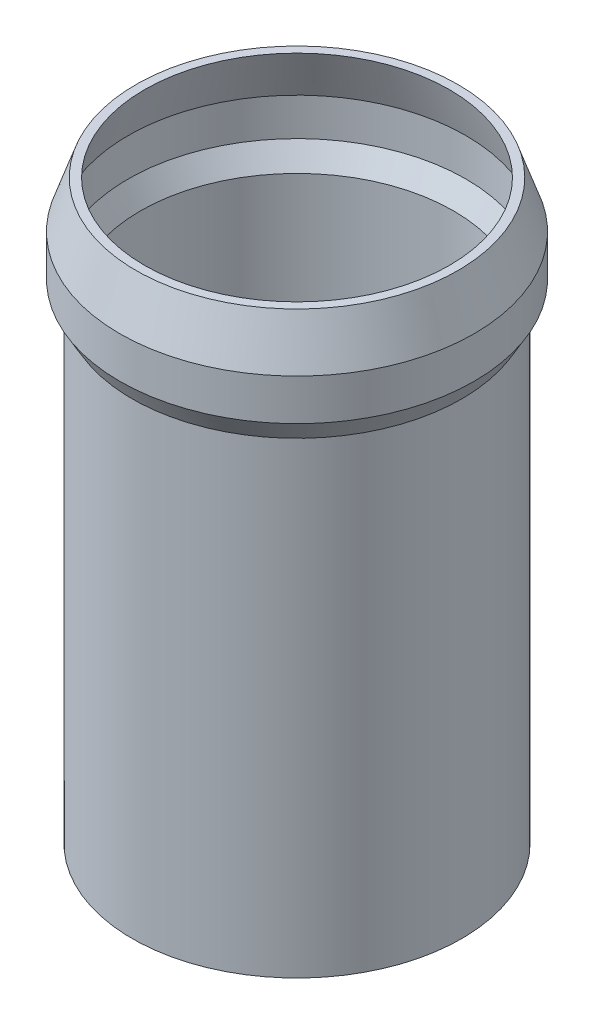
ISO-10303-21;
HEADER;
FILE_DESCRIPTION(('STEP AP214'),'2;1');
FILE_NAME('part.step','',(''),(''),'','','');
FILE_SCHEMA(('AUTOMOTIVE_DESIGN { 1 0 10303 214 1 1 1 1 }'));
ENDSEC;
DATA;
#1=APPLICATION_CONTEXT('core data for automotive mechanical design processes');
#2=APPLICATION_PROTOCOL_DEFINITION('international standard','automotive_design',2000,#1);
#3=PRODUCT_CONTEXT('',#1,'mechanical');
#4=PRODUCT('Part','Part','',(#3));
#5=PRODUCT_RELATED_PRODUCT_CATEGORY('part','',(#4));
#6=PRODUCT_DEFINITION_FORMATION('','',#4);
#7=PRODUCT_DEFINITION_CONTEXT('part definition',#1,'design');
#8=PRODUCT_DEFINITION('design','',#6,#7);
#9=PRODUCT_DEFINITION_SHAPE('','',#8);
#10=(LENGTH_UNIT() NAMED_UNIT(*) SI_UNIT(.MILLI.,.METRE.));
#11=(NAMED_UNIT(*) PLANE_ANGLE_UNIT() SI_UNIT($,.RADIAN.));
#12=(NAMED_UNIT(*) SI_UNIT($,.STERADIAN.) SOLID_ANGLE_UNIT());
#13=UNCERTAINTY_MEASURE_WITH_UNIT(LENGTH_MEASURE(1.E-05),#10,'distance_accuracy_value','');
#14=(GEOMETRIC_REPRESENTATION_CONTEXT(3) GLOBAL_UNCERTAINTY_ASSIGNED_CONTEXT((#13)) GLOBAL_UNIT_ASSIGNED_CONTEXT((#10,
#11,#12)) REPRESENTATION_CONTEXT('',''));
#15=CARTESIAN_POINT('',(0.,0.,0.));
#16=DIRECTION('',(0.,0.,1.));
#17=DIRECTION('',(1.,0.,0.));
#18=AXIS2_PLACEMENT_3D('',#15,#16,#17);
#19=CARTESIAN_POINT('',(20.,0.,0.));
#20=DIRECTION('',(0.,-1.,0.));
#21=DIRECTION('',(0.,0.,-1.));
#22=AXIS2_PLACEMENT_3D('',#19,#20,#21);
#23=PLANE('',#22);
#24=CARTESIAN_POINT('',(0.,0.,0.));
#25=DIRECTION('',(0.,-1.,0.));
#26=DIRECTION('',(0.,0.,-1.));
#27=AXIS2_PLACEMENT_3D('',#24,#25,#26);
#28=CIRCLE('',#27,20.);
#29=CARTESIAN_POINT('',(0.,0.,-20.));
#30=VERTEX_POINT('',#29);
#31=EDGE_CURVE('E80',#30,#30,#28,.T.);
#32=ORIENTED_EDGE('',*,*,#31,.T.);
#33=EDGE_LOOP('',(#32));
#34=FACE_BOUND('',#33,.T.);
#35=CARTESIAN_POINT('',(0.,0.,0.));
#36=DIRECTION('',(0.,-1.,0.));
#37=DIRECTION('',(0.,0.,-1.));
#38=AXIS2_PLACEMENT_3D('',#35,#36,#37);
#39=CIRCLE('',#38,19.);
#40=CARTESIAN_POINT('',(0.,0.,-19.));
#41=VERTEX_POINT('',#40);
#42=EDGE_CURVE('E53',#41,#41,#39,.T.);
#43=ORIENTED_EDGE('',*,*,#42,.F.);
#44=EDGE_LOOP('',(#43));
#45=FACE_BOUND('',#44,.T.);
#46=ADVANCED_FACE('F40',(#34,#45),#23,.T.);
#47=CARTESIAN_POINT('',(0.,2.4,0.));
#48=DIRECTION('',(0.,-1.,0.));
#49=DIRECTION('',(0.,0.,-1.));
#50=AXIS2_PLACEMENT_3D('',#47,#48,#49);
#51=CYLINDRICAL_SURFACE('',#50,19.);
#52=ORIENTED_EDGE('',*,*,#42,.T.);
#53=EDGE_LOOP('',(#52));
#54=FACE_BOUND('',#53,.T.);
#55=CARTESIAN_POINT('',(0.,1.15,0.));
#56=DIRECTION('',(0.,-1.,0.));
#57=DIRECTION('',(0.,0.,-1.));
#58=AXIS2_PLACEMENT_3D('',#55,#56,#57);
#59=CIRCLE('',#58,19.);
#60=CARTESIAN_POINT('',(0.,1.15,-19.));
#61=VERTEX_POINT('',#60);
#62=EDGE_CURVE('E58',#61,#61,#59,.T.);
#63=ORIENTED_EDGE('',*,*,#62,.F.);
#64=EDGE_LOOP('',(#63));
#65=FACE_BOUND('',#64,.T.);
#66=ADVANCED_FACE('F132',(#54,#65),#51,.F.);
#67=CARTESIAN_POINT('',(4.5,1.15,0.));
#68=DIRECTION('',(0.,-1.,0.));
#69=DIRECTION('',(0.,0.,-1.));
#70=AXIS2_PLACEMENT_3D('',#67,#68,#69);
#71=PLANE('',#70);
#72=CARTESIAN_POINT('',(0.,1.15,0.));
#73=DIRECTION('',(0.,-1.,0.));
#74=DIRECTION('',(0.,0.,-1.));
#75=AXIS2_PLACEMENT_3D('',#72,#73,#74);
#76=CIRCLE('',#75,6.);
#77=CARTESIAN_POINT('',(0.,1.15,-6.));
#78=VERTEX_POINT('',#77);
#79=EDGE_CURVE('E48',#78,#78,#76,.F.);
#80=ORIENTED_EDGE('',*,*,#79,.T.);
#81=EDGE_LOOP('',(#80));
#82=FACE_BOUND('',#81,.T.);
#83=ORIENTED_EDGE('',*,*,#62,.T.);
#84=EDGE_LOOP('',(#83));
#85=FACE_BOUND('',#84,.T.);
#86=ADVANCED_FACE('F137',(#82,#85),#71,.T.);
#87=CARTESIAN_POINT('',(4.5,2.4,0.));
#88=DIRECTION('',(0.,-1.,0.));
#89=DIRECTION('',(0.,0.,-1.));
#90=AXIS2_PLACEMENT_3D('',#87,#88,#89);
#91=PLANE('',#90);
#92=CARTESIAN_POINT('',(0.,2.4,0.));
#93=DIRECTION('',(0.,-1.,0.));
#94=DIRECTION('',(0.,0.,-1.));
#95=AXIS2_PLACEMENT_3D('',#92,#93,#94);
#96=CIRCLE('',#95,4.75);
#97=CARTESIAN_POINT('',(0.,2.4,-4.75));
#98=VERTEX_POINT('',#97);
#99=EDGE_CURVE('E12',#98,#98,#96,.T.);
#100=ORIENTED_EDGE('',*,*,#99,.T.);
#101=EDGE_LOOP('',(#100));
#102=FACE_BOUND('',#101,.T.);
#103=ADVANCED_FACE('F144',(#102),#91,.T.);
#104=CARTESIAN_POINT('',(19.5472629066576,69.9985359070053,0.));
#105=DIRECTION('',(0.,1.,0.));
#106=DIRECTION('',(0.,0.,1.));
#107=AXIS2_PLACEMENT_3D('',#104,#105,#106);
#108=PLANE('',#107);
#109=CARTESIAN_POINT('',(0.,69.9985359070053,0.));
#110=DIRECTION('',(0.,1.,0.));
#111=DIRECTION('',(0.,0.,1.));
#112=AXIS2_PLACEMENT_3D('',#109,#110,#111);
#113=CIRCLE('',#112,18.4896853417044);
#114=CARTESIAN_POINT('',(0.,69.9985359070053,18.4896853417044));
#115=VERTEX_POINT('',#114);
#116=EDGE_CURVE('E89',#115,#115,#113,.F.);
#117=ORIENTED_EDGE('',*,*,#116,.T.);
#118=EDGE_LOOP('',(#117));
#119=FACE_BOUND('',#118,.T.);
#120=CARTESIAN_POINT('',(0.,69.9985359070053,0.));
#121=DIRECTION('',(0.,-1.,0.));
#122=DIRECTION('',(0.,0.,-1.));
#123=AXIS2_PLACEMENT_3D('',#120,#121,#122);
#124=CIRCLE('',#123,19.5472629066576);
#125=CARTESIAN_POINT('',(0.,69.9985359070053,-19.5472629066576));
#126=VERTEX_POINT('',#125);
#127=EDGE_CURVE('E64',#126,#126,#124,.T.);
#128=ORIENTED_EDGE('',*,*,#127,.F.);
#129=EDGE_LOOP('',(#128));
#130=FACE_BOUND('',#129,.T.);
#131=ADVANCED_FACE('F147',(#119,#130),#108,.T.);
#132=CARTESIAN_POINT('',(0.,64.3251931671134,0.));
#133=DIRECTION('',(0.,-1.,0.));
#134=DIRECTION('',(0.,0.,-1.));
#135=AXIS2_PLACEMENT_3D('',#132,#133,#134);
#136=CONICAL_SURFACE('',#135,21.5,0.331494136143233);
#137=ORIENTED_EDGE('',*,*,#127,.T.);
#138=EDGE_LOOP('',(#137));
#139=FACE_BOUND('',#138,.T.);
#140=CARTESIAN_POINT('',(0.,64.3251931671134,0.));
#141=DIRECTION('',(0.,-1.,0.));
#142=DIRECTION('',(0.,0.,-1.));
#143=AXIS2_PLACEMENT_3D('',#140,#141,#142);
#144=CIRCLE('',#143,21.5);
#145=CARTESIAN_POINT('',(0.,64.3251931671134,-21.5));
#146=VERTEX_POINT('',#145);
#147=EDGE_CURVE('E68',#146,#146,#144,.T.);
#148=ORIENTED_EDGE('',*,*,#147,.F.);
#149=EDGE_LOOP('',(#148));
#150=FACE_BOUND('',#149,.T.);
#151=ADVANCED_FACE('F150',(#139,#150),#136,.T.);
#152=CARTESIAN_POINT('',(0.,2.4,0.));
#153=DIRECTION('',(0.,-1.,0.));
#154=DIRECTION('',(0.,0.,-1.));
#155=AXIS2_PLACEMENT_3D('',#152,#153,#154);
#156=CYLINDRICAL_SURFACE('',#155,21.5);
#157=ORIENTED_EDGE('',*,*,#147,.T.);
#158=EDGE_LOOP('',(#157));
#159=FACE_BOUND('',#158,.T.);
#160=CARTESIAN_POINT('',(0.,59.3251931671134,0.));
#161=DIRECTION('',(0.,-1.,0.));
#162=DIRECTION('',(0.,0.,-1.));
#163=AXIS2_PLACEMENT_3D('',#160,#161,#162);
#164=CIRCLE('',#163,21.5);
#165=CARTESIAN_POINT('',(0.,59.3251931671134,-21.5));
#166=VERTEX_POINT('',#165);
#167=EDGE_CURVE('E72',#166,#166,#164,.T.);
#168=ORIENTED_EDGE('',*,*,#167,.F.);
#169=EDGE_LOOP('',(#168));
#170=FACE_BOUND('',#169,.T.);
#171=ADVANCED_FACE('F154',(#159,#170),#156,.T.);
#172=CARTESIAN_POINT('',(0.,56.7271169557601,0.));
#173=DIRECTION('',(0.,1.,0.));
#174=DIRECTION('',(0.,0.,1.));
#175=AXIS2_PLACEMENT_3D('',#172,#173,#174);
#176=CONICAL_SURFACE('',#175,20.,0.523598775598301);
#177=ORIENTED_EDGE('',*,*,#167,.T.);
#178=EDGE_LOOP('',(#177));
#179=FACE_BOUND('',#178,.T.);
#180=CARTESIAN_POINT('',(0.,56.7271169557601,0.));
#181=DIRECTION('',(0.,-1.,0.));
#182=DIRECTION('',(0.,0.,-1.));
#183=AXIS2_PLACEMENT_3D('',#180,#181,#182);
#184=CIRCLE('',#183,20.);
#185=CARTESIAN_POINT('',(0.,56.7271169557601,-20.));
#186=VERTEX_POINT('',#185);
#187=EDGE_CURVE('E76',#186,#186,#184,.T.);
#188=ORIENTED_EDGE('',*,*,#187,.F.);
#189=EDGE_LOOP('',(#188));
#190=FACE_BOUND('',#189,.T.);
#191=ADVANCED_FACE('F158',(#179,#190),#176,.T.);
#192=CARTESIAN_POINT('',(0.,2.4,0.));
#193=DIRECTION('',(0.,-1.,0.));
#194=DIRECTION('',(0.,0.,-1.));
#195=AXIS2_PLACEMENT_3D('',#192,#193,#194);
#196=CYLINDRICAL_SURFACE('',#195,20.);
#197=ORIENTED_EDGE('',*,*,#187,.T.);
#198=EDGE_LOOP('',(#197));
#199=FACE_BOUND('',#198,.T.);
#200=ORIENTED_EDGE('',*,*,#31,.F.);
#201=EDGE_LOOP('',(#200));
#202=FACE_BOUND('',#201,.T.);
#203=ADVANCED_FACE('F162',(#199,#202),#196,.T.);
#204=CARTESIAN_POINT('',(0.,2.65,0.));
#205=DIRECTION('',(0.,-1.,0.));
#206=DIRECTION('',(0.,0.,-1.));
#207=AXIS2_PLACEMENT_3D('',#204,#205,#206);
#208=CONICAL_SURFACE('',#207,4.5,0.785398163397449);
#209=ORIENTED_EDGE('',*,*,#79,.F.);
#210=EDGE_LOOP('',(#209));
#211=FACE_BOUND('',#210,.T.);
#212=ORIENTED_EDGE('',*,*,#99,.F.);
#213=EDGE_LOOP('',(#212));
#214=FACE_BOUND('',#213,.T.);
#215=ADVANCED_FACE('F42',(#211,#214),#208,.F.);
#216=CARTESIAN_POINT('',(0.,2.4,0.));
#217=DIRECTION('',(0.,-1.,0.));
#218=DIRECTION('',(0.,0.,-1.));
#219=AXIS2_PLACEMENT_3D('',#216,#217,#218);
#220=CYLINDRICAL_SURFACE('',#219,19.);
#221=CARTESIAN_POINT('',(0.,56.9950661481912,0.));
#222=DIRECTION('',(0.,1.,0.));
#223=DIRECTION('',(0.,0.,1.));
#224=AXIS2_PLACEMENT_3D('',#221,#222,#223);
#225=CIRCLE('',#224,19.);
#226=CARTESIAN_POINT('',(0.,56.9950661481912,19.));
#227=VERTEX_POINT('',#226);
#228=EDGE_CURVE('E102',#227,#227,#225,.F.);
#229=ORIENTED_EDGE('',*,*,#228,.F.);
#230=EDGE_LOOP('',(#229));
#231=FACE_BOUND('',#230,.T.);
#232=CARTESIAN_POINT('',(0.,2.15,0.));
#233=DIRECTION('',(0.,-1.,0.));
#234=DIRECTION('',(0.,0.,-1.));
#235=AXIS2_PLACEMENT_3D('',#232,#233,#234);
#236=CIRCLE('',#235,19.);
#237=CARTESIAN_POINT('',(0.,2.15,-19.));
#238=VERTEX_POINT('',#237);
#239=EDGE_CURVE('E84',#238,#238,#236,.F.);
#240=ORIENTED_EDGE('',*,*,#239,.F.);
#241=EDGE_LOOP('',(#240));
#242=FACE_BOUND('',#241,.T.);
#243=ADVANCED_FACE('F119',(#231,#242),#220,.F.);
#244=CARTESIAN_POINT('',(4.5,2.15,0.));
#245=DIRECTION('',(0.,-1.,0.));
#246=DIRECTION('',(0.,0.,-1.));
#247=AXIS2_PLACEMENT_3D('',#244,#245,#246);
#248=PLANE('',#247);
#249=ORIENTED_EDGE('',*,*,#239,.T.);
#250=EDGE_LOOP('',(#249));
#251=FACE_BOUND('',#250,.T.);
#252=CARTESIAN_POINT('',(0.,2.15,0.));
#253=DIRECTION('',(0.,-1.,0.));
#254=DIRECTION('',(0.,0.,-1.));
#255=AXIS2_PLACEMENT_3D('',#252,#253,#254);
#256=CIRCLE('',#255,6.41421356237309);
#257=CARTESIAN_POINT('',(0.,2.15,-6.41421356237309));
#258=VERTEX_POINT('',#257);
#259=EDGE_CURVE('E93',#258,#258,#256,.F.);
#260=ORIENTED_EDGE('',*,*,#259,.F.);
#261=EDGE_LOOP('',(#260));
#262=FACE_BOUND('',#261,.T.);
#263=ADVANCED_FACE('F116',(#251,#262),#248,.F.);
#264=CARTESIAN_POINT('',(4.5,3.4,0.));
#265=DIRECTION('',(0.,-1.,0.));
#266=DIRECTION('',(0.,0.,-1.));
#267=AXIS2_PLACEMENT_3D('',#264,#265,#266);
#268=PLANE('',#267);
#269=CARTESIAN_POINT('',(0.,3.4,0.));
#270=DIRECTION('',(0.,-1.,0.));
#271=DIRECTION('',(0.,0.,-1.));
#272=AXIS2_PLACEMENT_3D('',#269,#270,#271);
#273=CIRCLE('',#272,5.1642135623731);
#274=CARTESIAN_POINT('',(0.,3.4,-5.1642135623731));
#275=VERTEX_POINT('',#274);
#276=EDGE_CURVE('E88',#275,#275,#273,.T.);
#277=ORIENTED_EDGE('',*,*,#276,.F.);
#278=EDGE_LOOP('',(#277));
#279=FACE_BOUND('',#278,.T.);
#280=ADVANCED_FACE('F118',(#279),#268,.F.);
#281=CARTESIAN_POINT('',(0.,63.9997369848896,0.));
#282=DIRECTION('',(0.,-1.,0.));
#283=DIRECTION('',(0.,0.,-1.));
#284=AXIS2_PLACEMENT_3D('',#281,#282,#283);
#285=CONICAL_SURFACE('',#284,20.5544428766847,0.331494136143233);
#286=ORIENTED_EDGE('',*,*,#116,.F.);
#287=EDGE_LOOP('',(#286));
#288=FACE_BOUND('',#287,.T.);
#289=CARTESIAN_POINT('',(0.,64.1579114264112,0.));
#290=DIRECTION('',(0.,-1.,0.));
#291=DIRECTION('',(0.,0.,-1.));
#292=AXIS2_PLACEMENT_3D('',#289,#290,#291);
#293=CIRCLE('',#292,20.5);
#294=CARTESIAN_POINT('',(0.,64.1579114264112,-20.5));
#295=VERTEX_POINT('',#294);
#296=EDGE_CURVE('E94',#295,#295,#293,.T.);
#297=ORIENTED_EDGE('',*,*,#296,.T.);
#298=EDGE_LOOP('',(#297));
#299=FACE_BOUND('',#298,.T.);
#300=ADVANCED_FACE('F126',(#288,#299),#285,.F.);
#301=CARTESIAN_POINT('',(0.,2.4,0.));
#302=DIRECTION('',(0.,-1.,0.));
#303=DIRECTION('',(0.,0.,-1.));
#304=AXIS2_PLACEMENT_3D('',#301,#302,#303);
#305=CYLINDRICAL_SURFACE('',#304,20.5);
#306=ORIENTED_EDGE('',*,*,#296,.F.);
#307=EDGE_LOOP('',(#306));
#308=FACE_BOUND('',#307,.T.);
#309=CARTESIAN_POINT('',(0.,59.5931423595445,0.));
#310=DIRECTION('',(0.,1.,0.));
#311=DIRECTION('',(0.,0.,1.));
#312=AXIS2_PLACEMENT_3D('',#309,#310,#311);
#313=CIRCLE('',#312,20.5);
#314=CARTESIAN_POINT('',(0.,59.5931423595445,20.5));
#315=VERTEX_POINT('',#314);
#316=EDGE_CURVE('E98',#315,#315,#313,.F.);
#317=ORIENTED_EDGE('',*,*,#316,.T.);
#318=EDGE_LOOP('',(#317));
#319=FACE_BOUND('',#318,.T.);
#320=ADVANCED_FACE('F172',(#308,#319),#305,.F.);
#321=CARTESIAN_POINT('',(0.,57.2271169557601,0.));
#322=DIRECTION('',(0.,1.,0.));
#323=DIRECTION('',(0.,0.,1.));
#324=AXIS2_PLACEMENT_3D('',#321,#322,#323);
#325=CONICAL_SURFACE('',#324,19.1339745962156,0.523598775598301);
#326=ORIENTED_EDGE('',*,*,#316,.F.);
#327=EDGE_LOOP('',(#326));
#328=FACE_BOUND('',#327,.T.);
#329=ORIENTED_EDGE('',*,*,#228,.T.);
#330=EDGE_LOOP('',(#329));
#331=FACE_BOUND('',#330,.T.);
#332=ADVANCED_FACE('F168',(#328,#331),#325,.F.);
#333=CARTESIAN_POINT('',(0.,3.35710678118655,0.));
#334=DIRECTION('',(0.,-1.,0.));
#335=DIRECTION('',(0.,0.,-1.));
#336=AXIS2_PLACEMENT_3D('',#333,#334,#335);
#337=CONICAL_SURFACE('',#336,5.20710678118655,0.785398163397449);
#338=ORIENTED_EDGE('',*,*,#259,.T.);
#339=EDGE_LOOP('',(#338));
#340=FACE_BOUND('',#339,.T.);
#341=ORIENTED_EDGE('',*,*,#276,.T.);
#342=EDGE_LOOP('',(#341));
#343=FACE_BOUND('',#342,.T.);
#344=ADVANCED_FACE('F113',(#340,#343),#337,.T.);
#345=CLOSED_SHELL('',(#46,#66,#86,#103,#131,#151,#171,#191,#203,#215,#243,#263,#280,#300,#320,
#332,#344));
#346=MANIFOLD_SOLID_BREP('B2',#345);
#347=ADVANCED_BREP_SHAPE_REPRESENTATION('',(#18,#346),#14);
#348=SHAPE_DEFINITION_REPRESENTATION(#9,#347);
ENDSEC;
END-ISO-10303-21;
